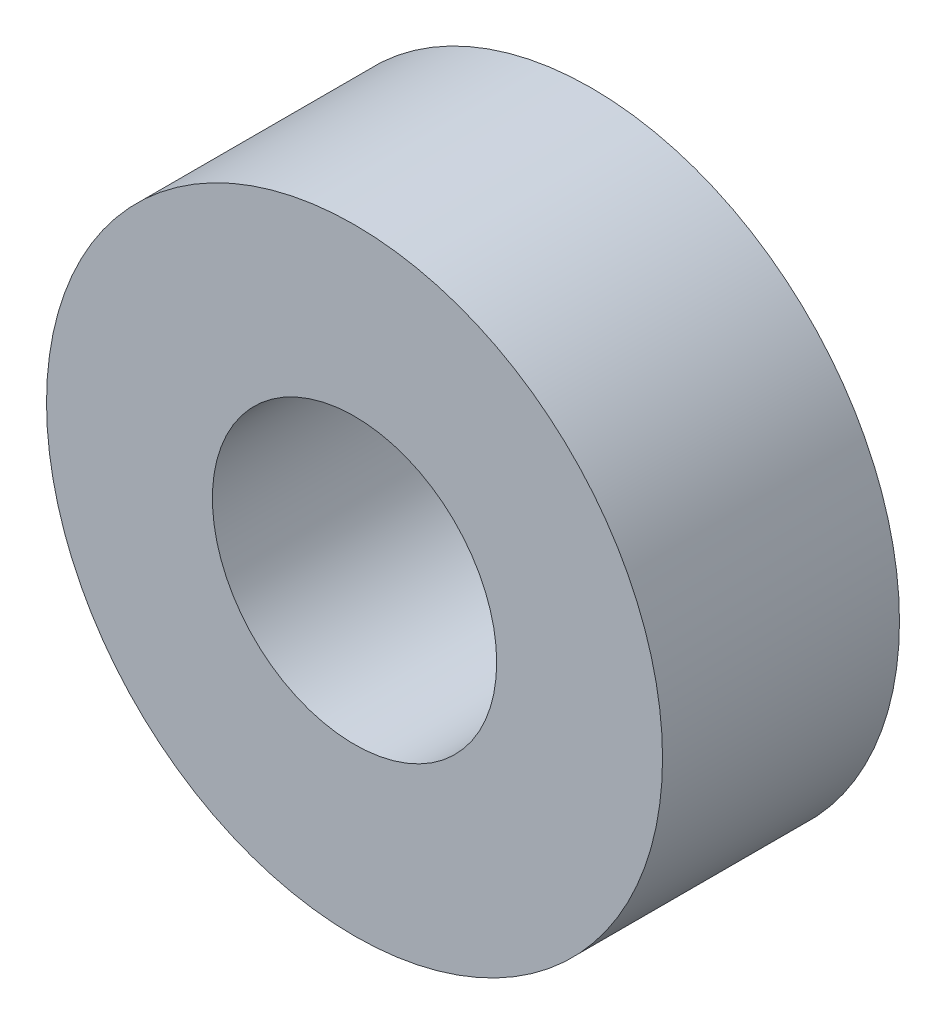
ISO-10303-21;
HEADER;
FILE_DESCRIPTION(('STEP AP214'),'2;1');
FILE_NAME('part.step','',(''),(''),'','','');
FILE_SCHEMA(('AUTOMOTIVE_DESIGN { 1 0 10303 214 1 1 1 1 }'));
ENDSEC;
DATA;
#1=APPLICATION_CONTEXT('core data for automotive mechanical design processes');
#2=APPLICATION_PROTOCOL_DEFINITION('international standard','automotive_design',2000,#1);
#3=PRODUCT_CONTEXT('',#1,'mechanical');
#4=PRODUCT('Part','Part','',(#3));
#5=PRODUCT_RELATED_PRODUCT_CATEGORY('part','',(#4));
#6=PRODUCT_DEFINITION_FORMATION('','',#4);
#7=PRODUCT_DEFINITION_CONTEXT('part definition',#1,'design');
#8=PRODUCT_DEFINITION('design','',#6,#7);
#9=PRODUCT_DEFINITION_SHAPE('','',#8);
#10=(LENGTH_UNIT() NAMED_UNIT(*) SI_UNIT(.MILLI.,.METRE.));
#11=(NAMED_UNIT(*) PLANE_ANGLE_UNIT() SI_UNIT($,.RADIAN.));
#12=(NAMED_UNIT(*) SI_UNIT($,.STERADIAN.) SOLID_ANGLE_UNIT());
#13=UNCERTAINTY_MEASURE_WITH_UNIT(LENGTH_MEASURE(1.E-05),#10,'distance_accuracy_value','');
#14=(GEOMETRIC_REPRESENTATION_CONTEXT(3) GLOBAL_UNCERTAINTY_ASSIGNED_CONTEXT((#13)) GLOBAL_UNIT_ASSIGNED_CONTEXT((#10,
#11,#12)) REPRESENTATION_CONTEXT('',''));
#15=CARTESIAN_POINT('',(0.,0.,0.));
#16=DIRECTION('',(0.,0.,1.));
#17=DIRECTION('',(1.,0.,0.));
#18=AXIS2_PLACEMENT_3D('',#15,#16,#17);
#19=CARTESIAN_POINT('',(0.,0.,5.));
#20=DIRECTION('',(0.,0.,1.));
#21=DIRECTION('',(1.,0.,0.));
#22=AXIS2_PLACEMENT_3D('',#19,#20,#21);
#23=PLANE('',#22);
#24=CARTESIAN_POINT('',(0.,0.,5.));
#25=DIRECTION('',(0.,0.,1.));
#26=DIRECTION('',(1.,0.,0.));
#27=AXIS2_PLACEMENT_3D('',#24,#25,#26);
#28=CIRCLE('',#27,6.5);
#29=CARTESIAN_POINT('',(6.5,0.,5.));
#30=VERTEX_POINT('',#29);
#31=EDGE_CURVE('E10',#30,#30,#28,.T.);
#32=ORIENTED_EDGE('',*,*,#31,.T.);
#33=EDGE_LOOP('',(#32));
#34=FACE_BOUND('',#33,.T.);
#35=CARTESIAN_POINT('',(0.,0.,5.));
#36=DIRECTION('',(0.,0.,1.));
#37=DIRECTION('',(1.,0.,0.));
#38=AXIS2_PLACEMENT_3D('',#35,#36,#37);
#39=CIRCLE('',#38,3.);
#40=CARTESIAN_POINT('',(3.,0.,5.));
#41=VERTEX_POINT('',#40);
#42=EDGE_CURVE('E41',#41,#41,#39,.T.);
#43=ORIENTED_EDGE('',*,*,#42,.F.);
#44=EDGE_LOOP('',(#43));
#45=FACE_BOUND('',#44,.T.);
#46=ADVANCED_FACE('F30',(#34,#45),#23,.T.);
#47=CARTESIAN_POINT('',(0.,0.,0.));
#48=DIRECTION('',(0.,0.,1.));
#49=DIRECTION('',(1.,0.,0.));
#50=AXIS2_PLACEMENT_3D('',#47,#48,#49);
#51=PLANE('',#50);
#52=CARTESIAN_POINT('',(0.,0.,0.));
#53=DIRECTION('',(0.,0.,1.));
#54=DIRECTION('',(1.,0.,0.));
#55=AXIS2_PLACEMENT_3D('',#52,#53,#54);
#56=CIRCLE('',#55,6.5);
#57=CARTESIAN_POINT('',(6.5,0.,0.));
#58=VERTEX_POINT('',#57);
#59=EDGE_CURVE('E34',#58,#58,#56,.T.);
#60=ORIENTED_EDGE('',*,*,#59,.F.);
#61=EDGE_LOOP('',(#60));
#62=FACE_BOUND('',#61,.T.);
#63=CARTESIAN_POINT('',(0.,0.,0.));
#64=DIRECTION('',(0.,0.,1.));
#65=DIRECTION('',(1.,0.,0.));
#66=AXIS2_PLACEMENT_3D('',#63,#64,#65);
#67=CIRCLE('',#66,3.);
#68=CARTESIAN_POINT('',(3.,0.,0.));
#69=VERTEX_POINT('',#68);
#70=EDGE_CURVE('E43',#69,#69,#67,.T.);
#71=ORIENTED_EDGE('',*,*,#70,.T.);
#72=EDGE_LOOP('',(#71));
#73=FACE_BOUND('',#72,.T.);
#74=ADVANCED_FACE('F53',(#62,#73),#51,.F.);
#75=CARTESIAN_POINT('',(0.,0.,5.));
#76=DIRECTION('',(0.,0.,-1.));
#77=DIRECTION('',(-1.,0.,0.));
#78=AXIS2_PLACEMENT_3D('',#75,#76,#77);
#79=CYLINDRICAL_SURFACE('',#78,6.5);
#80=ORIENTED_EDGE('',*,*,#31,.F.);
#81=EDGE_LOOP('',(#80));
#82=FACE_BOUND('',#81,.T.);
#83=ORIENTED_EDGE('',*,*,#59,.T.);
#84=EDGE_LOOP('',(#83));
#85=FACE_BOUND('',#84,.T.);
#86=ADVANCED_FACE('F32',(#82,#85),#79,.T.);
#87=CARTESIAN_POINT('',(0.,0.,5.));
#88=DIRECTION('',(0.,0.,-1.));
#89=DIRECTION('',(-1.,0.,0.));
#90=AXIS2_PLACEMENT_3D('',#87,#88,#89);
#91=CYLINDRICAL_SURFACE('',#90,3.);
#92=ORIENTED_EDGE('',*,*,#42,.T.);
#93=EDGE_LOOP('',(#92));
#94=FACE_BOUND('',#93,.T.);
#95=ORIENTED_EDGE('',*,*,#70,.F.);
#96=EDGE_LOOP('',(#95));
#97=FACE_BOUND('',#96,.T.);
#98=ADVANCED_FACE('F49',(#94,#97),#91,.F.);
#99=CLOSED_SHELL('',(#46,#74,#86,#98));
#100=MANIFOLD_SOLID_BREP('B2',#99);
#101=ADVANCED_BREP_SHAPE_REPRESENTATION('',(#18,#100),#14);
#102=SHAPE_DEFINITION_REPRESENTATION(#9,#101);
ENDSEC;
END-ISO-10303-21;
